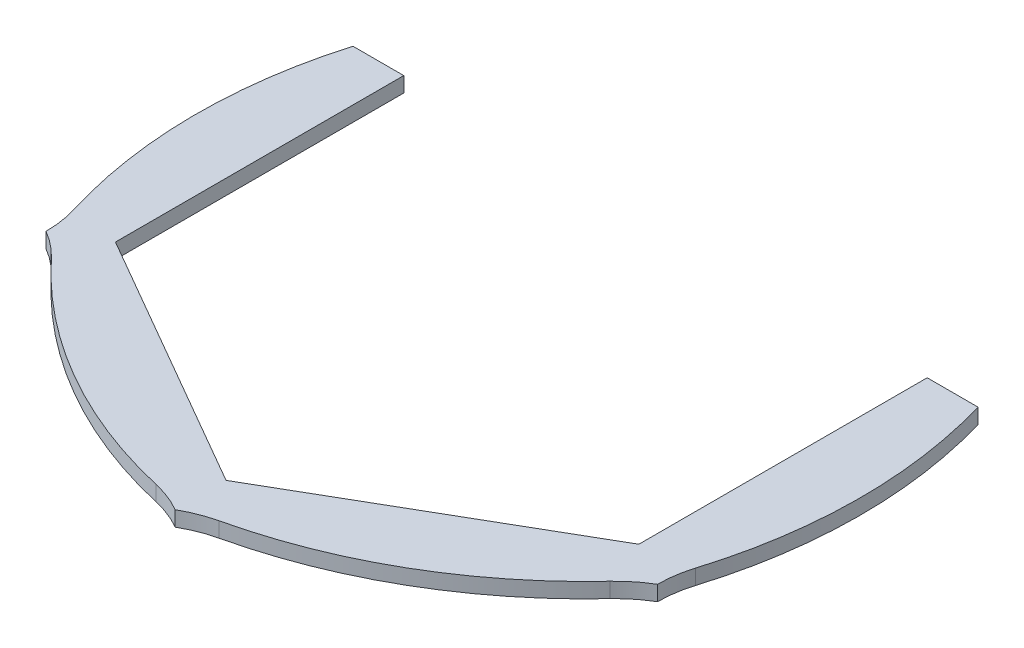
ISO-10303-21;
HEADER;
FILE_DESCRIPTION(('STEP AP214'),'2;1');
FILE_NAME('part.step','',(''),(''),'','','');
FILE_SCHEMA(('AUTOMOTIVE_DESIGN { 1 0 10303 214 1 1 1 1 }'));
ENDSEC;
DATA;
#1=APPLICATION_CONTEXT('core data for automotive mechanical design processes');
#2=APPLICATION_PROTOCOL_DEFINITION('international standard','automotive_design',2000,#1);
#3=PRODUCT_CONTEXT('',#1,'mechanical');
#4=PRODUCT('Part','Part','',(#3));
#5=PRODUCT_RELATED_PRODUCT_CATEGORY('part','',(#4));
#6=PRODUCT_DEFINITION_FORMATION('','',#4);
#7=PRODUCT_DEFINITION_CONTEXT('part definition',#1,'design');
#8=PRODUCT_DEFINITION('design','',#6,#7);
#9=PRODUCT_DEFINITION_SHAPE('','',#8);
#10=(LENGTH_UNIT() NAMED_UNIT(*) SI_UNIT(.MILLI.,.METRE.));
#11=(NAMED_UNIT(*) PLANE_ANGLE_UNIT() SI_UNIT($,.RADIAN.));
#12=(NAMED_UNIT(*) SI_UNIT($,.STERADIAN.) SOLID_ANGLE_UNIT());
#13=UNCERTAINTY_MEASURE_WITH_UNIT(LENGTH_MEASURE(1.E-05),#10,'distance_accuracy_value','');
#14=(GEOMETRIC_REPRESENTATION_CONTEXT(3) GLOBAL_UNCERTAINTY_ASSIGNED_CONTEXT((#13)) GLOBAL_UNIT_ASSIGNED_CONTEXT((#10,
#11,#12)) REPRESENTATION_CONTEXT('',''));
#15=CARTESIAN_POINT('',(0.,0.,0.));
#16=DIRECTION('',(0.,0.,1.));
#17=DIRECTION('',(1.,0.,0.));
#18=AXIS2_PLACEMENT_3D('',#15,#16,#17);
#19=CARTESIAN_POINT('',(-71.9615242270662,27.,-27.26));
#20=DIRECTION('',(0.,-1.,0.));
#21=DIRECTION('',(0.,0.,-1.));
#22=AXIS2_PLACEMENT_3D('',#19,#20,#21);
#23=PLANE('',#22);
#24=DIRECTION('',(0.,0.,-1.));
#25=VECTOR('',#24,1.);
#26=CARTESIAN_POINT('',(-51.9615242270664,27.,-29.9999999999999));
#27=LINE('',#26,#25);
#28=CARTESIAN_POINT('',(-51.9615242270663,27.,29.9999999999999));
#29=VERTEX_POINT('',#28);
#30=CARTESIAN_POINT('',(-51.9615242270664,27.,-27.25));
#31=VERTEX_POINT('',#30);
#32=EDGE_CURVE('E190',#29,#31,#27,.T.);
#33=ORIENTED_EDGE('',*,*,#32,.T.);
#34=DIRECTION('',(1.,0.,0.));
#35=VECTOR('',#34,1.);
#36=CARTESIAN_POINT('',(-113.272742430532,27.,-27.25));
#37=LINE('',#36,#35);
#38=CARTESIAN_POINT('',(-62.051338784967,27.,-27.25));
#39=VERTEX_POINT('',#38);
#40=EDGE_CURVE('E165',#39,#31,#37,.T.);
#41=ORIENTED_EDGE('',*,*,#40,.F.);
#42=CARTESIAN_POINT('',(30.9459065602488,27.,0.));
#43=DIRECTION('',(0.,-1.,0.));
#44=DIRECTION('',(0.,0.,-1.));
#45=AXIS2_PLACEMENT_3D('',#42,#43,#44);
#46=CIRCLE('',#45,96.907430787315);
#47=CARTESIAN_POINT('',(-61.6946190390513,27.,28.4391131803313));
#48=VERTEX_POINT('',#47);
#49=EDGE_CURVE('E163',#48,#39,#46,.T.);
#50=ORIENTED_EDGE('',*,*,#49,.F.);
#51=CARTESIAN_POINT('',(-83.2198544762642,27.,35.0470053837917));
#52=DIRECTION('',(0.,-1.,0.));
#53=DIRECTION('',(0.,0.,-1.));
#54=AXIS2_PLACEMENT_3D('',#51,#52,#53);
#55=CIRCLE('',#54,22.5166604983954);
#56=CARTESIAN_POINT('',(-60.7031939778688,27.,35.0470053837919));
#57=VERTEX_POINT('',#56);
#58=EDGE_CURVE('E46',#48,#57,#55,.T.);
#59=ORIENTED_EDGE('',*,*,#58,.T.);
#60=CARTESIAN_POINT('',(-71.9615242270667,27.,54.5470053837918));
#61=DIRECTION('',(0.,-1.,0.));
#62=DIRECTION('',(0.,0.,-1.));
#63=AXIS2_PLACEMENT_3D('',#60,#61,#62);
#64=CIRCLE('',#63,22.5166604983953);
#65=CARTESIAN_POINT('',(-55.4763039947933,27.,39.2095507744559));
#66=VERTEX_POINT('',#65);
#67=EDGE_CURVE('E161',#57,#66,#64,.T.);
#68=ORIENTED_EDGE('',*,*,#67,.T.);
#69=CARTESIAN_POINT('',(15.4729532801244,27.,-26.7999412243149));
#70=DIRECTION('',(0.,-1.,0.));
#71=DIRECTION('',(0.,0.,-1.));
#72=AXIS2_PLACEMENT_3D('',#69,#70,#71);
#73=CIRCLE('',#72,96.907430787315);
#74=CARTESIAN_POINT('',(-6.2183150442579,27.,67.6486639547871));
#75=VERTEX_POINT('',#74);
#76=EDGE_CURVE('E276',#66,#75,#73,.F.);
#77=ORIENTED_EDGE('',*,*,#76,.T.);
#78=CARTESIAN_POINT('',(-11.2583302491983,27.,89.5940107675848));
#79=DIRECTION('',(0.,-1.,0.));
#80=DIRECTION('',(0.,0.,-1.));
#81=AXIS2_PLACEMENT_3D('',#78,#79,#80);
#82=CIRCLE('',#81,22.5166604983954);
#83=CARTESIAN_POINT('',(-4.80518402845576E-13,27.,70.0940107675849));
#84=VERTEX_POINT('',#83);
#85=EDGE_CURVE('E273',#75,#84,#82,.T.);
#86=ORIENTED_EDGE('',*,*,#85,.T.);
#87=CARTESIAN_POINT('',(11.2583302491971,27.,89.594010767585));
#88=DIRECTION('',(0.,-1.,0.));
#89=DIRECTION('',(0.,0.,-1.));
#90=AXIS2_PLACEMENT_3D('',#87,#88,#89);
#91=CIRCLE('',#90,22.5166604983953);
#92=CARTESIAN_POINT('',(6.21831504425793,27.,67.6486639547871));
#93=VERTEX_POINT('',#92);
#94=EDGE_CURVE('E270',#84,#93,#91,.T.);
#95=ORIENTED_EDGE('',*,*,#94,.T.);
#96=CARTESIAN_POINT('',(-15.4729532801244,27.,-26.7999412243149));
#97=DIRECTION('',(0.,-1.,0.));
#98=DIRECTION('',(0.,0.,-1.));
#99=AXIS2_PLACEMENT_3D('',#96,#97,#98);
#100=CIRCLE('',#99,96.907430787315);
#101=CARTESIAN_POINT('',(55.4763039947933,27.,39.2095507744559));
#102=VERTEX_POINT('',#101);
#103=EDGE_CURVE('E267',#93,#102,#100,.F.);
#104=ORIENTED_EDGE('',*,*,#103,.T.);
#105=CARTESIAN_POINT('',(71.961524227066,27.,54.5470053837928));
#106=DIRECTION('',(0.,-1.,0.));
#107=DIRECTION('',(0.,0.,-1.));
#108=AXIS2_PLACEMENT_3D('',#105,#106,#107);
#109=CIRCLE('',#108,22.5166604983954);
#110=CARTESIAN_POINT('',(60.7031939778684,27.,35.0470053837927));
#111=VERTEX_POINT('',#110);
#112=EDGE_CURVE('E264',#102,#111,#109,.T.);
#113=ORIENTED_EDGE('',*,*,#112,.T.);
#114=CARTESIAN_POINT('',(83.2198544762638,27.,35.0470053837928));
#115=DIRECTION('',(0.,-1.,0.));
#116=DIRECTION('',(0.,0.,-1.));
#117=AXIS2_PLACEMENT_3D('',#114,#115,#116);
#118=CIRCLE('',#117,22.5166604983954);
#119=CARTESIAN_POINT('',(61.6946190390513,27.,28.4391131803312));
#120=VERTEX_POINT('',#119);
#121=EDGE_CURVE('E183',#111,#120,#118,.T.);
#122=ORIENTED_EDGE('',*,*,#121,.T.);
#123=CARTESIAN_POINT('',(-30.9459065602488,27.,0.));
#124=DIRECTION('',(0.,-1.,0.));
#125=DIRECTION('',(0.,0.,-1.));
#126=AXIS2_PLACEMENT_3D('',#123,#124,#125);
#127=CIRCLE('',#126,96.907430787315);
#128=CARTESIAN_POINT('',(62.0513387849669,27.,-27.25));
#129=VERTEX_POINT('',#128);
#130=EDGE_CURVE('E177',#120,#129,#127,.F.);
#131=ORIENTED_EDGE('',*,*,#130,.T.);
#132=DIRECTION('',(1.,0.,0.));
#133=VECTOR('',#132,1.);
#134=CARTESIAN_POINT('',(-113.272742430532,27.,-27.25));
#135=LINE('',#134,#133);
#136=CARTESIAN_POINT('',(51.9615242270662,27.,-27.25));
#137=VERTEX_POINT('',#136);
#138=EDGE_CURVE('E193',#137,#129,#135,.T.);
#139=ORIENTED_EDGE('',*,*,#138,.F.);
#140=DIRECTION('',(0.,0.,1.));
#141=VECTOR('',#140,1.);
#142=CARTESIAN_POINT('',(51.9615242270664,27.,29.9999999999998));
#143=LINE('',#142,#141);
#144=CARTESIAN_POINT('',(51.9615242270664,27.,29.9999999999998));
#145=VERTEX_POINT('',#144);
#146=EDGE_CURVE('E176',#137,#145,#143,.T.);
#147=ORIENTED_EDGE('',*,*,#146,.T.);
#148=DIRECTION('',(-0.866025403784439,0.,0.5));
#149=VECTOR('',#148,1.);
#150=CARTESIAN_POINT('',(0.,27.,59.9999999999999));
#151=LINE('',#150,#149);
#152=CARTESIAN_POINT('',(0.,27.,59.9999999999999));
#153=VERTEX_POINT('',#152);
#154=EDGE_CURVE('E180',#145,#153,#151,.T.);
#155=ORIENTED_EDGE('',*,*,#154,.T.);
#156=DIRECTION('',(-0.866025403784439,0.,-0.5));
#157=VECTOR('',#156,1.);
#158=CARTESIAN_POINT('',(-51.9615242270663,27.,29.9999999999999));
#159=LINE('',#158,#157);
#160=EDGE_CURVE('E258',#153,#29,#159,.T.);
#161=ORIENTED_EDGE('',*,*,#160,.T.);
#162=EDGE_LOOP('',(#33,#41,#50,#59,#68,#77,#86,#95,#104,#113,#122,#131,#139,#147,#155,#161));
#163=FACE_BOUND('',#162,.T.);
#164=ADVANCED_FACE('F42',(#163),#23,.F.);
#165=CARTESIAN_POINT('',(-71.9615242270662,24.,-27.26));
#166=DIRECTION('',(0.,-1.,0.));
#167=DIRECTION('',(0.,0.,-1.));
#168=AXIS2_PLACEMENT_3D('',#165,#166,#167);
#169=PLANE('',#168);
#170=DIRECTION('',(0.,0.,-1.));
#171=VECTOR('',#170,1.);
#172=CARTESIAN_POINT('',(-51.9615242270664,24.,-29.9999999999999));
#173=LINE('',#172,#171);
#174=CARTESIAN_POINT('',(-51.9615242270663,24.,29.9999999999999));
#175=VERTEX_POINT('',#174);
#176=CARTESIAN_POINT('',(-51.9615242270664,24.,-27.25));
#177=VERTEX_POINT('',#176);
#178=EDGE_CURVE('E194',#175,#177,#173,.T.);
#179=ORIENTED_EDGE('',*,*,#178,.F.);
#180=DIRECTION('',(-0.866025403784439,0.,-0.5));
#181=VECTOR('',#180,1.);
#182=CARTESIAN_POINT('',(-51.9615242270663,24.,29.9999999999999));
#183=LINE('',#182,#181);
#184=CARTESIAN_POINT('',(0.,24.,59.9999999999999));
#185=VERTEX_POINT('',#184);
#186=EDGE_CURVE('E196',#185,#175,#183,.T.);
#187=ORIENTED_EDGE('',*,*,#186,.F.);
#188=DIRECTION('',(-0.866025403784439,0.,0.5));
#189=VECTOR('',#188,1.);
#190=CARTESIAN_POINT('',(0.,24.,59.9999999999999));
#191=LINE('',#190,#189);
#192=CARTESIAN_POINT('',(51.9615242270664,24.,29.9999999999998));
#193=VERTEX_POINT('',#192);
#194=EDGE_CURVE('E198',#193,#185,#191,.T.);
#195=ORIENTED_EDGE('',*,*,#194,.F.);
#196=DIRECTION('',(0.,0.,1.));
#197=VECTOR('',#196,1.);
#198=CARTESIAN_POINT('',(51.9615242270664,24.,29.9999999999998));
#199=LINE('',#198,#197);
#200=CARTESIAN_POINT('',(51.9615242270662,24.,-27.25));
#201=VERTEX_POINT('',#200);
#202=EDGE_CURVE('E169',#201,#193,#199,.T.);
#203=ORIENTED_EDGE('',*,*,#202,.F.);
#204=DIRECTION('',(1.,0.,0.));
#205=VECTOR('',#204,1.);
#206=CARTESIAN_POINT('',(-113.272742430532,24.,-27.25));
#207=LINE('',#206,#205);
#208=CARTESIAN_POINT('',(62.0513387849669,24.,-27.25));
#209=VERTEX_POINT('',#208);
#210=EDGE_CURVE('E189',#201,#209,#207,.T.);
#211=ORIENTED_EDGE('',*,*,#210,.T.);
#212=CARTESIAN_POINT('',(-30.9459065602488,24.,0.));
#213=DIRECTION('',(0.,-1.,0.));
#214=DIRECTION('',(0.,0.,-1.));
#215=AXIS2_PLACEMENT_3D('',#212,#213,#214);
#216=CIRCLE('',#215,96.907430787315);
#217=CARTESIAN_POINT('',(61.6946190390513,24.,28.4391131803312));
#218=VERTEX_POINT('',#217);
#219=EDGE_CURVE('E168',#218,#209,#216,.F.);
#220=ORIENTED_EDGE('',*,*,#219,.F.);
#221=CARTESIAN_POINT('',(83.2198544762638,24.,35.0470053837928));
#222=DIRECTION('',(0.,-1.,0.));
#223=DIRECTION('',(0.,0.,-1.));
#224=AXIS2_PLACEMENT_3D('',#221,#222,#223);
#225=CIRCLE('',#224,22.5166604983954);
#226=CARTESIAN_POINT('',(60.7031939778684,24.,35.0470053837927));
#227=VERTEX_POINT('',#226);
#228=EDGE_CURVE('E202',#227,#218,#225,.T.);
#229=ORIENTED_EDGE('',*,*,#228,.F.);
#230=CARTESIAN_POINT('',(71.961524227066,24.,54.5470053837928));
#231=DIRECTION('',(0.,-1.,0.));
#232=DIRECTION('',(0.,0.,-1.));
#233=AXIS2_PLACEMENT_3D('',#230,#231,#232);
#234=CIRCLE('',#233,22.5166604983954);
#235=CARTESIAN_POINT('',(55.4763039947933,24.,39.2095507744559));
#236=VERTEX_POINT('',#235);
#237=EDGE_CURVE('E204',#236,#227,#234,.T.);
#238=ORIENTED_EDGE('',*,*,#237,.F.);
#239=CARTESIAN_POINT('',(-15.4729532801244,24.,-26.7999412243149));
#240=DIRECTION('',(0.,-1.,0.));
#241=DIRECTION('',(0.,0.,-1.));
#242=AXIS2_PLACEMENT_3D('',#239,#240,#241);
#243=CIRCLE('',#242,96.907430787315);
#244=CARTESIAN_POINT('',(6.21831504425793,24.,67.6486639547871));
#245=VERTEX_POINT('',#244);
#246=EDGE_CURVE('E206',#245,#236,#243,.F.);
#247=ORIENTED_EDGE('',*,*,#246,.F.);
#248=CARTESIAN_POINT('',(11.2583302491971,24.,89.594010767585));
#249=DIRECTION('',(0.,-1.,0.));
#250=DIRECTION('',(0.,0.,-1.));
#251=AXIS2_PLACEMENT_3D('',#248,#249,#250);
#252=CIRCLE('',#251,22.5166604983953);
#253=CARTESIAN_POINT('',(-4.80518402845576E-13,24.,70.0940107675849));
#254=VERTEX_POINT('',#253);
#255=EDGE_CURVE('E208',#254,#245,#252,.T.);
#256=ORIENTED_EDGE('',*,*,#255,.F.);
#257=CARTESIAN_POINT('',(-11.2583302491983,24.,89.5940107675848));
#258=DIRECTION('',(0.,-1.,0.));
#259=DIRECTION('',(0.,0.,-1.));
#260=AXIS2_PLACEMENT_3D('',#257,#258,#259);
#261=CIRCLE('',#260,22.5166604983954);
#262=CARTESIAN_POINT('',(-6.2183150442579,24.,67.6486639547871));
#263=VERTEX_POINT('',#262);
#264=EDGE_CURVE('E210',#263,#254,#261,.T.);
#265=ORIENTED_EDGE('',*,*,#264,.F.);
#266=CARTESIAN_POINT('',(15.4729532801244,24.,-26.7999412243149));
#267=DIRECTION('',(0.,-1.,0.));
#268=DIRECTION('',(0.,0.,-1.));
#269=AXIS2_PLACEMENT_3D('',#266,#267,#268);
#270=CIRCLE('',#269,96.907430787315);
#271=CARTESIAN_POINT('',(-55.4763039947933,24.,39.2095507744559));
#272=VERTEX_POINT('',#271);
#273=EDGE_CURVE('E212',#272,#263,#270,.F.);
#274=ORIENTED_EDGE('',*,*,#273,.F.);
#275=CARTESIAN_POINT('',(-71.9615242270667,24.,54.5470053837918));
#276=DIRECTION('',(0.,-1.,0.));
#277=DIRECTION('',(0.,0.,-1.));
#278=AXIS2_PLACEMENT_3D('',#275,#276,#277);
#279=CIRCLE('',#278,22.5166604983953);
#280=CARTESIAN_POINT('',(-60.7031939778688,24.,35.0470053837919));
#281=VERTEX_POINT('',#280);
#282=EDGE_CURVE('E214',#281,#272,#279,.T.);
#283=ORIENTED_EDGE('',*,*,#282,.F.);
#284=CARTESIAN_POINT('',(-83.2198544762642,24.,35.0470053837917));
#285=DIRECTION('',(0.,-1.,0.));
#286=DIRECTION('',(0.,0.,-1.));
#287=AXIS2_PLACEMENT_3D('',#284,#285,#286);
#288=CIRCLE('',#287,22.5166604983954);
#289=CARTESIAN_POINT('',(-61.6946190390513,24.,28.4391131803313));
#290=VERTEX_POINT('',#289);
#291=EDGE_CURVE('E59',#290,#281,#288,.T.);
#292=ORIENTED_EDGE('',*,*,#291,.F.);
#293=CARTESIAN_POINT('',(30.9459065602488,24.,0.));
#294=DIRECTION('',(0.,-1.,0.));
#295=DIRECTION('',(0.,0.,-1.));
#296=AXIS2_PLACEMENT_3D('',#293,#294,#295);
#297=CIRCLE('',#296,96.907430787315);
#298=CARTESIAN_POINT('',(-62.051338784967,24.,-27.25));
#299=VERTEX_POINT('',#298);
#300=EDGE_CURVE('E172',#290,#299,#297,.T.);
#301=ORIENTED_EDGE('',*,*,#300,.T.);
#302=DIRECTION('',(1.,0.,0.));
#303=VECTOR('',#302,1.);
#304=CARTESIAN_POINT('',(-113.272742430532,24.,-27.25));
#305=LINE('',#304,#303);
#306=EDGE_CURVE('E187',#299,#177,#305,.T.);
#307=ORIENTED_EDGE('',*,*,#306,.T.);
#308=EDGE_LOOP('',(#179,#187,#195,#203,#211,#220,#229,#238,#247,#256,#265,#274,#283,#292,#301,#307));
#309=FACE_BOUND('',#308,.T.);
#310=ADVANCED_FACE('F324',(#309),#169,.T.);
#311=CARTESIAN_POINT('',(-51.9615242270664,9.,-29.9999999999999));
#312=DIRECTION('',(1.,0.,0.));
#313=DIRECTION('',(0.,0.,-1.));
#314=AXIS2_PLACEMENT_3D('',#311,#312,#313);
#315=PLANE('',#314);
#316=ORIENTED_EDGE('',*,*,#32,.F.);
#317=DIRECTION('',(0.,-1.,0.));
#318=VECTOR('',#317,1.);
#319=CARTESIAN_POINT('',(-51.9615242270663,9.,29.9999999999999));
#320=LINE('',#319,#318);
#321=EDGE_CURVE('E245',#29,#175,#320,.T.);
#322=ORIENTED_EDGE('',*,*,#321,.T.);
#323=ORIENTED_EDGE('',*,*,#178,.T.);
#324=DIRECTION('',(0.,-1.,0.));
#325=VECTOR('',#324,1.);
#326=CARTESIAN_POINT('',(-51.9615242270664,9.,-27.25));
#327=LINE('',#326,#325);
#328=EDGE_CURVE('E249',#31,#177,#327,.T.);
#329=ORIENTED_EDGE('',*,*,#328,.F.);
#330=EDGE_LOOP('',(#316,#322,#323,#329));
#331=FACE_BOUND('',#330,.T.);
#332=ADVANCED_FACE('F321',(#331),#315,.T.);
#333=CARTESIAN_POINT('',(-51.9615242270663,9.,29.9999999999999));
#334=DIRECTION('',(0.5,0.,-0.866025403784439));
#335=DIRECTION('',(-0.866025403784439,0.,-0.5));
#336=AXIS2_PLACEMENT_3D('',#333,#334,#335);
#337=PLANE('',#336);
#338=ORIENTED_EDGE('',*,*,#160,.F.);
#339=DIRECTION('',(0.,-1.,0.));
#340=VECTOR('',#339,1.);
#341=CARTESIAN_POINT('',(0.,9.,59.9999999999999));
#342=LINE('',#341,#340);
#343=EDGE_CURVE('E242',#153,#185,#342,.T.);
#344=ORIENTED_EDGE('',*,*,#343,.T.);
#345=ORIENTED_EDGE('',*,*,#186,.T.);
#346=ORIENTED_EDGE('',*,*,#321,.F.);
#347=EDGE_LOOP('',(#338,#344,#345,#346));
#348=FACE_BOUND('',#347,.T.);
#349=ADVANCED_FACE('F331',(#348),#337,.T.);
#350=CARTESIAN_POINT('',(0.,9.,59.9999999999999));
#351=DIRECTION('',(-0.5,0.,-0.866025403784439));
#352=DIRECTION('',(-0.866025403784439,0.,0.5));
#353=AXIS2_PLACEMENT_3D('',#350,#351,#352);
#354=PLANE('',#353);
#355=ORIENTED_EDGE('',*,*,#154,.F.);
#356=DIRECTION('',(0.,-1.,0.));
#357=VECTOR('',#356,1.);
#358=CARTESIAN_POINT('',(51.9615242270664,9.,29.9999999999998));
#359=LINE('',#358,#357);
#360=EDGE_CURVE('E239',#145,#193,#359,.T.);
#361=ORIENTED_EDGE('',*,*,#360,.T.);
#362=ORIENTED_EDGE('',*,*,#194,.T.);
#363=ORIENTED_EDGE('',*,*,#343,.F.);
#364=EDGE_LOOP('',(#355,#361,#362,#363));
#365=FACE_BOUND('',#364,.T.);
#366=ADVANCED_FACE('F342',(#365),#354,.T.);
#367=CARTESIAN_POINT('',(-113.272742430532,-42.01,-27.25));
#368=DIRECTION('',(0.,0.,1.));
#369=DIRECTION('',(1.,0.,0.));
#370=AXIS2_PLACEMENT_3D('',#367,#368,#369);
#371=PLANE('',#370);
#372=DIRECTION('',(0.,-1.,0.));
#373=VECTOR('',#372,1.);
#374=CARTESIAN_POINT('',(-62.051338784967,321.635622017633,-27.25));
#375=LINE('',#374,#373);
#376=EDGE_CURVE('E173',#39,#299,#375,.T.);
#377=ORIENTED_EDGE('',*,*,#376,.F.);
#378=ORIENTED_EDGE('',*,*,#40,.T.);
#379=ORIENTED_EDGE('',*,*,#328,.T.);
#380=ORIENTED_EDGE('',*,*,#306,.F.);
#381=EDGE_LOOP('',(#377,#378,#379,#380));
#382=FACE_BOUND('',#381,.T.);
#383=ADVANCED_FACE('F316',(#382),#371,.F.);
#384=DIRECTION('',(0.,1.,0.));
#385=VECTOR('',#384,1.);
#386=CARTESIAN_POINT('',(51.9615242270662,9.,-27.25));
#387=LINE('',#386,#385);
#388=EDGE_CURVE('E252',#201,#137,#387,.T.);
#389=ORIENTED_EDGE('',*,*,#388,.T.);
#390=ORIENTED_EDGE('',*,*,#138,.T.);
#391=DIRECTION('',(0.,-1.,0.));
#392=VECTOR('',#391,1.);
#393=CARTESIAN_POINT('',(62.0513387849669,321.635622017633,-27.25));
#394=LINE('',#393,#392);
#395=EDGE_CURVE('E216',#129,#209,#394,.T.);
#396=ORIENTED_EDGE('',*,*,#395,.T.);
#397=ORIENTED_EDGE('',*,*,#210,.F.);
#398=EDGE_LOOP('',(#389,#390,#396,#397));
#399=FACE_BOUND('',#398,.T.);
#400=ADVANCED_FACE('F312',(#399),#371,.F.);
#401=CARTESIAN_POINT('',(-30.9459065602488,321.635622017633,0.));
#402=DIRECTION('',(0.,-1.,0.));
#403=DIRECTION('',(0.,0.,-1.));
#404=AXIS2_PLACEMENT_3D('',#401,#402,#403);
#405=CYLINDRICAL_SURFACE('',#404,96.907430787315);
#406=ORIENTED_EDGE('',*,*,#130,.F.);
#407=DIRECTION('',(0.,-1.,0.));
#408=VECTOR('',#407,1.);
#409=CARTESIAN_POINT('',(61.6946190390513,321.635622017633,28.4391131803312));
#410=LINE('',#409,#408);
#411=EDGE_CURVE('E51',#120,#218,#410,.T.);
#412=ORIENTED_EDGE('',*,*,#411,.T.);
#413=ORIENTED_EDGE('',*,*,#219,.T.);
#414=ORIENTED_EDGE('',*,*,#395,.F.);
#415=EDGE_LOOP('',(#406,#412,#413,#414));
#416=FACE_BOUND('',#415,.T.);
#417=ADVANCED_FACE('F309',(#416),#405,.T.);
#418=CARTESIAN_POINT('',(83.2198544762638,321.635622017633,35.0470053837928));
#419=DIRECTION('',(0.,-1.,0.));
#420=DIRECTION('',(0.,0.,-1.));
#421=AXIS2_PLACEMENT_3D('',#418,#419,#420);
#422=CYLINDRICAL_SURFACE('',#421,22.5166604983954);
#423=ORIENTED_EDGE('',*,*,#121,.F.);
#424=DIRECTION('',(0.,-1.,0.));
#425=VECTOR('',#424,1.);
#426=CARTESIAN_POINT('',(60.7031939778684,321.635622017633,35.0470053837927));
#427=LINE('',#426,#425);
#428=EDGE_CURVE('E220',#111,#227,#427,.T.);
#429=ORIENTED_EDGE('',*,*,#428,.T.);
#430=ORIENTED_EDGE('',*,*,#228,.T.);
#431=ORIENTED_EDGE('',*,*,#411,.F.);
#432=EDGE_LOOP('',(#423,#429,#430,#431));
#433=FACE_BOUND('',#432,.T.);
#434=ADVANCED_FACE('F306',(#433),#422,.F.);
#435=CARTESIAN_POINT('',(71.961524227066,321.635622017633,54.5470053837928));
#436=DIRECTION('',(0.,-1.,0.));
#437=DIRECTION('',(0.,0.,-1.));
#438=AXIS2_PLACEMENT_3D('',#435,#436,#437);
#439=CYLINDRICAL_SURFACE('',#438,22.5166604983954);
#440=ORIENTED_EDGE('',*,*,#112,.F.);
#441=DIRECTION('',(0.,-1.,0.));
#442=VECTOR('',#441,1.);
#443=CARTESIAN_POINT('',(55.4763039947933,321.635622017633,39.2095507744559));
#444=LINE('',#443,#442);
#445=EDGE_CURVE('E223',#102,#236,#444,.T.);
#446=ORIENTED_EDGE('',*,*,#445,.T.);
#447=ORIENTED_EDGE('',*,*,#237,.T.);
#448=ORIENTED_EDGE('',*,*,#428,.F.);
#449=EDGE_LOOP('',(#440,#446,#447,#448));
#450=FACE_BOUND('',#449,.T.);
#451=ADVANCED_FACE('F299',(#450),#439,.F.);
#452=CARTESIAN_POINT('',(-15.4729532801244,321.635622017633,-26.7999412243149));
#453=DIRECTION('',(0.,-1.,0.));
#454=DIRECTION('',(0.,0.,-1.));
#455=AXIS2_PLACEMENT_3D('',#452,#453,#454);
#456=CYLINDRICAL_SURFACE('',#455,96.907430787315);
#457=ORIENTED_EDGE('',*,*,#103,.F.);
#458=DIRECTION('',(0.,-1.,0.));
#459=VECTOR('',#458,1.);
#460=CARTESIAN_POINT('',(6.21831504425793,321.635622017633,67.6486639547871));
#461=LINE('',#460,#459);
#462=EDGE_CURVE('E226',#93,#245,#461,.T.);
#463=ORIENTED_EDGE('',*,*,#462,.T.);
#464=ORIENTED_EDGE('',*,*,#246,.T.);
#465=ORIENTED_EDGE('',*,*,#445,.F.);
#466=EDGE_LOOP('',(#457,#463,#464,#465));
#467=FACE_BOUND('',#466,.T.);
#468=ADVANCED_FACE('F296',(#467),#456,.T.);
#469=CARTESIAN_POINT('',(11.2583302491971,321.635622017633,89.594010767585));
#470=DIRECTION('',(0.,-1.,0.));
#471=DIRECTION('',(0.,0.,-1.));
#472=AXIS2_PLACEMENT_3D('',#469,#470,#471);
#473=CYLINDRICAL_SURFACE('',#472,22.5166604983953);
#474=ORIENTED_EDGE('',*,*,#94,.F.);
#475=DIRECTION('',(0.,-1.,0.));
#476=VECTOR('',#475,1.);
#477=CARTESIAN_POINT('',(-4.80518402845576E-13,321.635622017633,70.0940107675849));
#478=LINE('',#477,#476);
#479=EDGE_CURVE('E229',#84,#254,#478,.T.);
#480=ORIENTED_EDGE('',*,*,#479,.T.);
#481=ORIENTED_EDGE('',*,*,#255,.T.);
#482=ORIENTED_EDGE('',*,*,#462,.F.);
#483=EDGE_LOOP('',(#474,#480,#481,#482));
#484=FACE_BOUND('',#483,.T.);
#485=ADVANCED_FACE('F293',(#484),#473,.F.);
#486=CARTESIAN_POINT('',(-11.2583302491983,321.635622017633,89.5940107675848));
#487=DIRECTION('',(0.,-1.,0.));
#488=DIRECTION('',(0.,0.,-1.));
#489=AXIS2_PLACEMENT_3D('',#486,#487,#488);
#490=CYLINDRICAL_SURFACE('',#489,22.5166604983954);
#491=ORIENTED_EDGE('',*,*,#85,.F.);
#492=DIRECTION('',(0.,-1.,0.));
#493=VECTOR('',#492,1.);
#494=CARTESIAN_POINT('',(-6.2183150442579,321.635622017633,67.6486639547871));
#495=LINE('',#494,#493);
#496=EDGE_CURVE('E232',#75,#263,#495,.T.);
#497=ORIENTED_EDGE('',*,*,#496,.T.);
#498=ORIENTED_EDGE('',*,*,#264,.T.);
#499=ORIENTED_EDGE('',*,*,#479,.F.);
#500=EDGE_LOOP('',(#491,#497,#498,#499));
#501=FACE_BOUND('',#500,.T.);
#502=ADVANCED_FACE('F287',(#501),#490,.F.);
#503=CARTESIAN_POINT('',(15.4729532801244,321.635622017633,-26.7999412243149));
#504=DIRECTION('',(0.,-1.,0.));
#505=DIRECTION('',(0.,0.,-1.));
#506=AXIS2_PLACEMENT_3D('',#503,#504,#505);
#507=CYLINDRICAL_SURFACE('',#506,96.907430787315);
#508=ORIENTED_EDGE('',*,*,#76,.F.);
#509=DIRECTION('',(0.,-1.,0.));
#510=VECTOR('',#509,1.);
#511=CARTESIAN_POINT('',(-55.4763039947933,321.635622017633,39.2095507744559));
#512=LINE('',#511,#510);
#513=EDGE_CURVE('E235',#66,#272,#512,.T.);
#514=ORIENTED_EDGE('',*,*,#513,.T.);
#515=ORIENTED_EDGE('',*,*,#273,.T.);
#516=ORIENTED_EDGE('',*,*,#496,.F.);
#517=EDGE_LOOP('',(#508,#514,#515,#516));
#518=FACE_BOUND('',#517,.T.);
#519=ADVANCED_FACE('F284',(#518),#507,.T.);
#520=CARTESIAN_POINT('',(-71.9615242270667,321.635622017633,54.5470053837918));
#521=DIRECTION('',(0.,-1.,0.));
#522=DIRECTION('',(0.,0.,-1.));
#523=AXIS2_PLACEMENT_3D('',#520,#521,#522);
#524=CYLINDRICAL_SURFACE('',#523,22.5166604983953);
#525=ORIENTED_EDGE('',*,*,#67,.F.);
#526=DIRECTION('',(0.,-1.,0.));
#527=VECTOR('',#526,1.);
#528=CARTESIAN_POINT('',(-60.7031939778688,321.635622017633,35.0470053837919));
#529=LINE('',#528,#527);
#530=EDGE_CURVE('E158',#57,#281,#529,.T.);
#531=ORIENTED_EDGE('',*,*,#530,.T.);
#532=ORIENTED_EDGE('',*,*,#282,.T.);
#533=ORIENTED_EDGE('',*,*,#513,.F.);
#534=EDGE_LOOP('',(#525,#531,#532,#533));
#535=FACE_BOUND('',#534,.T.);
#536=ADVANCED_FACE('F281',(#535),#524,.F.);
#537=CARTESIAN_POINT('',(30.9459065602488,321.635622017633,0.));
#538=DIRECTION('',(0.,-1.,0.));
#539=DIRECTION('',(0.,0.,-1.));
#540=AXIS2_PLACEMENT_3D('',#537,#538,#539);
#541=CYLINDRICAL_SURFACE('',#540,96.907430787315);
#542=DIRECTION('',(0.,-1.,0.));
#543=VECTOR('',#542,1.);
#544=CARTESIAN_POINT('',(-61.6946190390513,321.635622017633,28.4391131803313));
#545=LINE('',#544,#543);
#546=EDGE_CURVE('E11',#48,#290,#545,.T.);
#547=ORIENTED_EDGE('',*,*,#546,.F.);
#548=ORIENTED_EDGE('',*,*,#49,.T.);
#549=ORIENTED_EDGE('',*,*,#376,.T.);
#550=ORIENTED_EDGE('',*,*,#300,.F.);
#551=EDGE_LOOP('',(#547,#548,#549,#550));
#552=FACE_BOUND('',#551,.T.);
#553=ADVANCED_FACE('F171',(#552),#541,.T.);
#554=CARTESIAN_POINT('',(-83.2198544762642,321.635622017633,35.0470053837917));
#555=DIRECTION('',(0.,-1.,0.));
#556=DIRECTION('',(0.,0.,-1.));
#557=AXIS2_PLACEMENT_3D('',#554,#555,#556);
#558=CYLINDRICAL_SURFACE('',#557,22.5166604983954);
#559=ORIENTED_EDGE('',*,*,#58,.F.);
#560=ORIENTED_EDGE('',*,*,#546,.T.);
#561=ORIENTED_EDGE('',*,*,#291,.T.);
#562=ORIENTED_EDGE('',*,*,#530,.F.);
#563=EDGE_LOOP('',(#559,#560,#561,#562));
#564=FACE_BOUND('',#563,.T.);
#565=ADVANCED_FACE('F155',(#564),#558,.F.);
#566=CARTESIAN_POINT('',(51.9615242270664,9.,29.9999999999998));
#567=DIRECTION('',(-1.,0.,0.));
#568=DIRECTION('',(0.,0.,1.));
#569=AXIS2_PLACEMENT_3D('',#566,#567,#568);
#570=PLANE('',#569);
#571=ORIENTED_EDGE('',*,*,#146,.F.);
#572=ORIENTED_EDGE('',*,*,#388,.F.);
#573=ORIENTED_EDGE('',*,*,#202,.T.);
#574=ORIENTED_EDGE('',*,*,#360,.F.);
#575=EDGE_LOOP('',(#571,#572,#573,#574));
#576=FACE_BOUND('',#575,.T.);
#577=ADVANCED_FACE('F44',(#576),#570,.T.);
#578=CLOSED_SHELL('',(#164,#310,#332,#349,#366,#383,#400,#417,#434,#451,#468,#485,#502,#519,
#536,#553,#565,#577));
#579=MANIFOLD_SOLID_BREP('B2',#578);
#580=ADVANCED_BREP_SHAPE_REPRESENTATION('',(#18,#579),#14);
#581=SHAPE_DEFINITION_REPRESENTATION(#9,#580);
ENDSEC;
END-ISO-10303-21;
